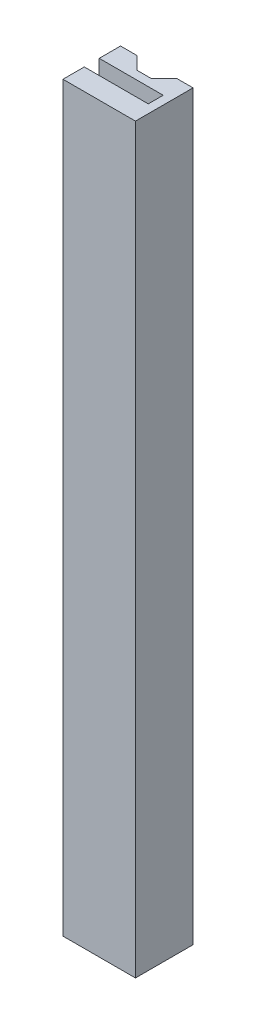
ISO-10303-21;
HEADER;
FILE_DESCRIPTION(('STEP AP214'),'2;1');
FILE_NAME('part.step','',(''),(''),'','','');
FILE_SCHEMA(('AUTOMOTIVE_DESIGN { 1 0 10303 214 1 1 1 1 }'));
ENDSEC;
DATA;
#1=APPLICATION_CONTEXT('core data for automotive mechanical design processes');
#2=APPLICATION_PROTOCOL_DEFINITION('international standard','automotive_design',2000,#1);
#3=PRODUCT_CONTEXT('',#1,'mechanical');
#4=PRODUCT('Part','Part','',(#3));
#5=PRODUCT_RELATED_PRODUCT_CATEGORY('part','',(#4));
#6=PRODUCT_DEFINITION_FORMATION('','',#4);
#7=PRODUCT_DEFINITION_CONTEXT('part definition',#1,'design');
#8=PRODUCT_DEFINITION('design','',#6,#7);
#9=PRODUCT_DEFINITION_SHAPE('','',#8);
#10=(LENGTH_UNIT() NAMED_UNIT(*) SI_UNIT(.MILLI.,.METRE.));
#11=(NAMED_UNIT(*) PLANE_ANGLE_UNIT() SI_UNIT($,.RADIAN.));
#12=(NAMED_UNIT(*) SI_UNIT($,.STERADIAN.) SOLID_ANGLE_UNIT());
#13=UNCERTAINTY_MEASURE_WITH_UNIT(LENGTH_MEASURE(1.E-05),#10,'distance_accuracy_value','');
#14=(GEOMETRIC_REPRESENTATION_CONTEXT(3) GLOBAL_UNCERTAINTY_ASSIGNED_CONTEXT((#13)) GLOBAL_UNIT_ASSIGNED_CONTEXT((#10,
#11,#12)) REPRESENTATION_CONTEXT('',''));
#15=CARTESIAN_POINT('',(0.,0.,0.));
#16=DIRECTION('',(0.,0.,1.));
#17=DIRECTION('',(1.,0.,0.));
#18=AXIS2_PLACEMENT_3D('',#15,#16,#17);
#19=CARTESIAN_POINT('',(-8.49813275223096,174.,-8.49999999999999));
#20=DIRECTION('',(1.,0.,0.));
#21=DIRECTION('',(0.,0.,-1.));
#22=AXIS2_PLACEMENT_3D('',#19,#20,#21);
#23=PLANE('',#22);
#24=DIRECTION('',(0.,0.,1.));
#25=VECTOR('',#24,1.);
#26=CARTESIAN_POINT('',(-8.49813275223096,0.,-8.49999999999999));
#27=LINE('',#26,#25);
#28=CARTESIAN_POINT('',(-8.49813275223096,0.,-13.5));
#29=VERTEX_POINT('',#28);
#30=CARTESIAN_POINT('',(-8.49813275223096,0.,-8.49999999999999));
#31=VERTEX_POINT('',#30);
#32=EDGE_CURVE('E154',#29,#31,#27,.T.);
#33=ORIENTED_EDGE('',*,*,#32,.T.);
#34=DIRECTION('',(0.,-1.,0.));
#35=VECTOR('',#34,1.);
#36=CARTESIAN_POINT('',(-8.49813275223096,174.,-8.49999999999999));
#37=LINE('',#36,#35);
#38=CARTESIAN_POINT('',(-8.49813275223096,174.,-8.49999999999999));
#39=VERTEX_POINT('',#38);
#40=EDGE_CURVE('E11',#39,#31,#37,.T.);
#41=ORIENTED_EDGE('',*,*,#40,.F.);
#42=DIRECTION('',(0.,0.,1.));
#43=VECTOR('',#42,1.);
#44=CARTESIAN_POINT('',(-8.49813275223096,174.,-8.49999999999999));
#45=LINE('',#44,#43);
#46=CARTESIAN_POINT('',(-8.49813275223096,174.,-13.5));
#47=VERTEX_POINT('',#46);
#48=EDGE_CURVE('E176',#47,#39,#45,.T.);
#49=ORIENTED_EDGE('',*,*,#48,.F.);
#50=DIRECTION('',(0.,-1.,0.));
#51=VECTOR('',#50,1.);
#52=CARTESIAN_POINT('',(-8.49813275223096,174.,-13.5));
#53=LINE('',#52,#51);
#54=EDGE_CURVE('E150',#47,#29,#53,.T.);
#55=ORIENTED_EDGE('',*,*,#54,.T.);
#56=EDGE_LOOP('',(#33,#41,#49,#55));
#57=FACE_BOUND('',#56,.T.);
#58=ADVANCED_FACE('F34',(#57),#23,.F.);
#59=CARTESIAN_POINT('',(6.50186724776904,174.,-8.5));
#60=DIRECTION('',(0.,0.,-1.));
#61=DIRECTION('',(-1.,0.,0.));
#62=AXIS2_PLACEMENT_3D('',#59,#60,#61);
#63=PLANE('',#62);
#64=DIRECTION('',(1.,0.,0.));
#65=VECTOR('',#64,1.);
#66=CARTESIAN_POINT('',(6.50186724776904,0.,-8.5));
#67=LINE('',#66,#65);
#68=CARTESIAN_POINT('',(6.50186724776904,0.,-8.5));
#69=VERTEX_POINT('',#68);
#70=EDGE_CURVE('E157',#31,#69,#67,.T.);
#71=ORIENTED_EDGE('',*,*,#70,.T.);
#72=DIRECTION('',(0.,-1.,0.));
#73=VECTOR('',#72,1.);
#74=CARTESIAN_POINT('',(6.50186724776904,174.,-8.5));
#75=LINE('',#74,#73);
#76=CARTESIAN_POINT('',(6.50186724776904,174.,-8.5));
#77=VERTEX_POINT('',#76);
#78=EDGE_CURVE('E42',#77,#69,#75,.T.);
#79=ORIENTED_EDGE('',*,*,#78,.F.);
#80=DIRECTION('',(1.,0.,0.));
#81=VECTOR('',#80,1.);
#82=CARTESIAN_POINT('',(6.50186724776904,174.,-8.5));
#83=LINE('',#82,#81);
#84=EDGE_CURVE('E105',#39,#77,#83,.T.);
#85=ORIENTED_EDGE('',*,*,#84,.F.);
#86=ORIENTED_EDGE('',*,*,#40,.T.);
#87=EDGE_LOOP('',(#71,#79,#85,#86));
#88=FACE_BOUND('',#87,.T.);
#89=ADVANCED_FACE('F254',(#88),#63,.F.);
#90=CARTESIAN_POINT('',(6.50186724776904,174.,-5.));
#91=DIRECTION('',(1.,0.,0.));
#92=DIRECTION('',(0.,0.,-1.));
#93=AXIS2_PLACEMENT_3D('',#90,#91,#92);
#94=PLANE('',#93);
#95=DIRECTION('',(0.,0.,1.));
#96=VECTOR('',#95,1.);
#97=CARTESIAN_POINT('',(6.50186724776904,0.,-5.));
#98=LINE('',#97,#96);
#99=CARTESIAN_POINT('',(6.50186724776904,0.,-5.));
#100=VERTEX_POINT('',#99);
#101=EDGE_CURVE('E159',#69,#100,#98,.T.);
#102=ORIENTED_EDGE('',*,*,#101,.T.);
#103=DIRECTION('',(0.,-1.,0.));
#104=VECTOR('',#103,1.);
#105=CARTESIAN_POINT('',(6.50186724776904,174.,-5.));
#106=LINE('',#105,#104);
#107=CARTESIAN_POINT('',(6.50186724776904,174.,-5.));
#108=VERTEX_POINT('',#107);
#109=EDGE_CURVE('E195',#108,#100,#106,.T.);
#110=ORIENTED_EDGE('',*,*,#109,.F.);
#111=DIRECTION('',(0.,0.,1.));
#112=VECTOR('',#111,1.);
#113=CARTESIAN_POINT('',(6.50186724776904,174.,-5.));
#114=LINE('',#113,#112);
#115=EDGE_CURVE('E203',#77,#108,#114,.T.);
#116=ORIENTED_EDGE('',*,*,#115,.F.);
#117=ORIENTED_EDGE('',*,*,#78,.T.);
#118=EDGE_LOOP('',(#102,#110,#116,#117));
#119=FACE_BOUND('',#118,.T.);
#120=ADVANCED_FACE('F201',(#119),#94,.F.);
#121=CARTESIAN_POINT('',(-8.49813275223096,174.,-5.));
#122=DIRECTION('',(0.,0.,1.));
#123=DIRECTION('',(1.,0.,0.));
#124=AXIS2_PLACEMENT_3D('',#121,#122,#123);
#125=PLANE('',#124);
#126=DIRECTION('',(-1.,0.,0.));
#127=VECTOR('',#126,1.);
#128=CARTESIAN_POINT('',(-8.49813275223096,0.,-5.));
#129=LINE('',#128,#127);
#130=CARTESIAN_POINT('',(-8.49813275223096,0.,-5.));
#131=VERTEX_POINT('',#130);
#132=EDGE_CURVE('E161',#100,#131,#129,.T.);
#133=ORIENTED_EDGE('',*,*,#132,.T.);
#134=DIRECTION('',(0.,-1.,0.));
#135=VECTOR('',#134,1.);
#136=CARTESIAN_POINT('',(-8.49813275223096,174.,-5.));
#137=LINE('',#136,#135);
#138=CARTESIAN_POINT('',(-8.49813275223096,174.,-5.));
#139=VERTEX_POINT('',#138);
#140=EDGE_CURVE('E192',#139,#131,#137,.T.);
#141=ORIENTED_EDGE('',*,*,#140,.F.);
#142=DIRECTION('',(-1.,0.,0.));
#143=VECTOR('',#142,1.);
#144=CARTESIAN_POINT('',(-8.49813275223096,174.,-5.));
#145=LINE('',#144,#143);
#146=EDGE_CURVE('E221',#108,#139,#145,.T.);
#147=ORIENTED_EDGE('',*,*,#146,.F.);
#148=ORIENTED_EDGE('',*,*,#109,.T.);
#149=EDGE_LOOP('',(#133,#141,#147,#148));
#150=FACE_BOUND('',#149,.T.);
#151=ADVANCED_FACE('F212',(#150),#125,.F.);
#152=CARTESIAN_POINT('',(-8.49813275223096,174.,0.));
#153=DIRECTION('',(1.,0.,0.));
#154=DIRECTION('',(0.,0.,-1.));
#155=AXIS2_PLACEMENT_3D('',#152,#153,#154);
#156=PLANE('',#155);
#157=DIRECTION('',(0.,0.,1.));
#158=VECTOR('',#157,1.);
#159=CARTESIAN_POINT('',(-8.49813275223096,0.,0.));
#160=LINE('',#159,#158);
#161=CARTESIAN_POINT('',(-8.49813275223096,0.,0.));
#162=VERTEX_POINT('',#161);
#163=EDGE_CURVE('E163',#131,#162,#160,.T.);
#164=ORIENTED_EDGE('',*,*,#163,.T.);
#165=DIRECTION('',(0.,-1.,0.));
#166=VECTOR('',#165,1.);
#167=CARTESIAN_POINT('',(-8.49813275223096,174.,0.));
#168=LINE('',#167,#166);
#169=CARTESIAN_POINT('',(-8.49813275223096,174.,0.));
#170=VERTEX_POINT('',#169);
#171=EDGE_CURVE('E189',#170,#162,#168,.T.);
#172=ORIENTED_EDGE('',*,*,#171,.F.);
#173=DIRECTION('',(0.,0.,1.));
#174=VECTOR('',#173,1.);
#175=CARTESIAN_POINT('',(-8.49813275223096,174.,0.));
#176=LINE('',#175,#174);
#177=EDGE_CURVE('E218',#139,#170,#176,.T.);
#178=ORIENTED_EDGE('',*,*,#177,.F.);
#179=ORIENTED_EDGE('',*,*,#140,.T.);
#180=EDGE_LOOP('',(#164,#172,#178,#179));
#181=FACE_BOUND('',#180,.T.);
#182=ADVANCED_FACE('F216',(#181),#156,.F.);
#183=CARTESIAN_POINT('',(8.49813275223096,174.,0.));
#184=DIRECTION('',(0.,0.,-1.));
#185=DIRECTION('',(-1.,0.,0.));
#186=AXIS2_PLACEMENT_3D('',#183,#184,#185);
#187=PLANE('',#186);
#188=DIRECTION('',(1.,0.,0.));
#189=VECTOR('',#188,1.);
#190=CARTESIAN_POINT('',(8.49813275223096,0.,0.));
#191=LINE('',#190,#189);
#192=CARTESIAN_POINT('',(8.49813275223096,0.,0.));
#193=VERTEX_POINT('',#192);
#194=EDGE_CURVE('E165',#162,#193,#191,.T.);
#195=ORIENTED_EDGE('',*,*,#194,.T.);
#196=DIRECTION('',(0.,-1.,0.));
#197=VECTOR('',#196,1.);
#198=CARTESIAN_POINT('',(8.49813275223096,174.,0.));
#199=LINE('',#198,#197);
#200=CARTESIAN_POINT('',(8.49813275223096,174.,0.));
#201=VERTEX_POINT('',#200);
#202=EDGE_CURVE('E186',#201,#193,#199,.T.);
#203=ORIENTED_EDGE('',*,*,#202,.F.);
#204=DIRECTION('',(1.,0.,0.));
#205=VECTOR('',#204,1.);
#206=CARTESIAN_POINT('',(8.49813275223096,174.,0.));
#207=LINE('',#206,#205);
#208=EDGE_CURVE('E220',#170,#201,#207,.T.);
#209=ORIENTED_EDGE('',*,*,#208,.F.);
#210=ORIENTED_EDGE('',*,*,#171,.T.);
#211=EDGE_LOOP('',(#195,#203,#209,#210));
#212=FACE_BOUND('',#211,.T.);
#213=ADVANCED_FACE('F267',(#212),#187,.F.);
#214=CARTESIAN_POINT('',(8.49813275223096,174.,-13.5));
#215=DIRECTION('',(-1.,0.,0.));
#216=DIRECTION('',(0.,0.,1.));
#217=AXIS2_PLACEMENT_3D('',#214,#215,#216);
#218=PLANE('',#217);
#219=DIRECTION('',(0.,0.,-1.));
#220=VECTOR('',#219,1.);
#221=CARTESIAN_POINT('',(8.49813275223096,0.,-13.5));
#222=LINE('',#221,#220);
#223=CARTESIAN_POINT('',(8.49813275223096,0.,-13.5));
#224=VERTEX_POINT('',#223);
#225=EDGE_CURVE('E167',#193,#224,#222,.T.);
#226=ORIENTED_EDGE('',*,*,#225,.T.);
#227=DIRECTION('',(0.,-1.,0.));
#228=VECTOR('',#227,1.);
#229=CARTESIAN_POINT('',(8.49813275223096,174.,-13.5));
#230=LINE('',#229,#228);
#231=CARTESIAN_POINT('',(8.49813275223096,174.,-13.5));
#232=VERTEX_POINT('',#231);
#233=EDGE_CURVE('E183',#232,#224,#230,.T.);
#234=ORIENTED_EDGE('',*,*,#233,.F.);
#235=DIRECTION('',(0.,0.,-1.));
#236=VECTOR('',#235,1.);
#237=CARTESIAN_POINT('',(8.49813275223096,174.,-13.5));
#238=LINE('',#237,#236);
#239=EDGE_CURVE('E223',#201,#232,#238,.T.);
#240=ORIENTED_EDGE('',*,*,#239,.F.);
#241=ORIENTED_EDGE('',*,*,#202,.T.);
#242=EDGE_LOOP('',(#226,#234,#240,#241));
#243=FACE_BOUND('',#242,.T.);
#244=ADVANCED_FACE('F270',(#243),#218,.F.);
#245=CARTESIAN_POINT('',(4.64813275223096,174.,-13.5));
#246=DIRECTION('',(0.,0.,1.));
#247=DIRECTION('',(1.,0.,0.));
#248=AXIS2_PLACEMENT_3D('',#245,#246,#247);
#249=PLANE('',#248);
#250=DIRECTION('',(-1.,0.,0.));
#251=VECTOR('',#250,1.);
#252=CARTESIAN_POINT('',(4.64813275223096,0.,-13.5));
#253=LINE('',#252,#251);
#254=CARTESIAN_POINT('',(4.64813275223096,0.,-13.5));
#255=VERTEX_POINT('',#254);
#256=EDGE_CURVE('E169',#224,#255,#253,.T.);
#257=ORIENTED_EDGE('',*,*,#256,.T.);
#258=DIRECTION('',(0.,-1.,0.));
#259=VECTOR('',#258,1.);
#260=CARTESIAN_POINT('',(4.64813275223096,174.,-13.5));
#261=LINE('',#260,#259);
#262=CARTESIAN_POINT('',(4.64813275223096,174.,-13.5));
#263=VERTEX_POINT('',#262);
#264=EDGE_CURVE('E180',#263,#255,#261,.T.);
#265=ORIENTED_EDGE('',*,*,#264,.F.);
#266=DIRECTION('',(-1.,0.,0.));
#267=VECTOR('',#266,1.);
#268=CARTESIAN_POINT('',(4.64813275223096,174.,-13.5));
#269=LINE('',#268,#267);
#270=EDGE_CURVE('E229',#232,#263,#269,.T.);
#271=ORIENTED_EDGE('',*,*,#270,.F.);
#272=ORIENTED_EDGE('',*,*,#233,.T.);
#273=EDGE_LOOP('',(#257,#265,#271,#272));
#274=FACE_BOUND('',#273,.T.);
#275=ADVANCED_FACE('F235',(#274),#249,.F.);
#276=CARTESIAN_POINT('',(1.65,174.,-10.501867247769));
#277=DIRECTION('',(0.707106781186547,0.,0.707106781186548));
#278=DIRECTION('',(0.707106781186548,0.,-0.707106781186547));
#279=AXIS2_PLACEMENT_3D('',#276,#277,#278);
#280=PLANE('',#279);
#281=DIRECTION('',(-0.707106781186548,0.,0.707106781186547));
#282=VECTOR('',#281,1.);
#283=CARTESIAN_POINT('',(1.65,0.,-10.501867247769));
#284=LINE('',#283,#282);
#285=CARTESIAN_POINT('',(1.65,0.,-10.501867247769));
#286=VERTEX_POINT('',#285);
#287=EDGE_CURVE('E171',#255,#286,#284,.T.);
#288=ORIENTED_EDGE('',*,*,#287,.T.);
#289=DIRECTION('',(0.,-1.,0.));
#290=VECTOR('',#289,1.);
#291=CARTESIAN_POINT('',(1.65,174.,-10.501867247769));
#292=LINE('',#291,#290);
#293=CARTESIAN_POINT('',(1.65,174.,-10.501867247769));
#294=VERTEX_POINT('',#293);
#295=EDGE_CURVE('E145',#294,#286,#292,.T.);
#296=ORIENTED_EDGE('',*,*,#295,.F.);
#297=DIRECTION('',(-0.707106781186548,0.,0.707106781186547));
#298=VECTOR('',#297,1.);
#299=CARTESIAN_POINT('',(1.65,174.,-10.501867247769));
#300=LINE('',#299,#298);
#301=EDGE_CURVE('E136',#263,#294,#300,.T.);
#302=ORIENTED_EDGE('',*,*,#301,.F.);
#303=ORIENTED_EDGE('',*,*,#264,.T.);
#304=EDGE_LOOP('',(#288,#296,#302,#303));
#305=FACE_BOUND('',#304,.T.);
#306=ADVANCED_FACE('F239',(#305),#280,.F.);
#307=CARTESIAN_POINT('',(-1.65,174.,-10.501867247769));
#308=DIRECTION('',(0.,0.,1.));
#309=DIRECTION('',(1.,0.,0.));
#310=AXIS2_PLACEMENT_3D('',#307,#308,#309);
#311=PLANE('',#310);
#312=DIRECTION('',(-1.,0.,0.));
#313=VECTOR('',#312,1.);
#314=CARTESIAN_POINT('',(-1.65,0.,-10.501867247769));
#315=LINE('',#314,#313);
#316=CARTESIAN_POINT('',(-1.65,0.,-10.501867247769));
#317=VERTEX_POINT('',#316);
#318=EDGE_CURVE('E144',#286,#317,#315,.T.);
#319=ORIENTED_EDGE('',*,*,#318,.T.);
#320=DIRECTION('',(0.,-1.,0.));
#321=VECTOR('',#320,1.);
#322=CARTESIAN_POINT('',(-1.65,174.,-10.501867247769));
#323=LINE('',#322,#321);
#324=CARTESIAN_POINT('',(-1.65,174.,-10.501867247769));
#325=VERTEX_POINT('',#324);
#326=EDGE_CURVE('E141',#325,#317,#323,.T.);
#327=ORIENTED_EDGE('',*,*,#326,.F.);
#328=DIRECTION('',(-1.,0.,0.));
#329=VECTOR('',#328,1.);
#330=CARTESIAN_POINT('',(-1.65,174.,-10.501867247769));
#331=LINE('',#330,#329);
#332=EDGE_CURVE('E130',#294,#325,#331,.T.);
#333=ORIENTED_EDGE('',*,*,#332,.F.);
#334=ORIENTED_EDGE('',*,*,#295,.T.);
#335=EDGE_LOOP('',(#319,#327,#333,#334));
#336=FACE_BOUND('',#335,.T.);
#337=ADVANCED_FACE('F142',(#336),#311,.F.);
#338=CARTESIAN_POINT('',(-4.64813275223096,174.,-13.5));
#339=DIRECTION('',(-0.707106781186547,0.,0.707106781186548));
#340=DIRECTION('',(0.707106781186548,0.,0.707106781186547));
#341=AXIS2_PLACEMENT_3D('',#338,#339,#340);
#342=PLANE('',#341);
#343=DIRECTION('',(-0.707106781186548,0.,-0.707106781186547));
#344=VECTOR('',#343,1.);
#345=CARTESIAN_POINT('',(-4.64813275223096,0.,-13.5));
#346=LINE('',#345,#344);
#347=CARTESIAN_POINT('',(-4.64813275223096,0.,-13.5));
#348=VERTEX_POINT('',#347);
#349=EDGE_CURVE('E91',#317,#348,#346,.T.);
#350=ORIENTED_EDGE('',*,*,#349,.T.);
#351=DIRECTION('',(0.,-1.,0.));
#352=VECTOR('',#351,1.);
#353=CARTESIAN_POINT('',(-4.64813275223096,174.,-13.5));
#354=LINE('',#353,#352);
#355=CARTESIAN_POINT('',(-4.64813275223096,174.,-13.5));
#356=VERTEX_POINT('',#355);
#357=EDGE_CURVE('E146',#356,#348,#354,.T.);
#358=ORIENTED_EDGE('',*,*,#357,.F.);
#359=DIRECTION('',(-0.707106781186548,0.,-0.707106781186547));
#360=VECTOR('',#359,1.);
#361=CARTESIAN_POINT('',(-4.64813275223096,174.,-13.5));
#362=LINE('',#361,#360);
#363=EDGE_CURVE('E134',#325,#356,#362,.T.);
#364=ORIENTED_EDGE('',*,*,#363,.F.);
#365=ORIENTED_EDGE('',*,*,#326,.T.);
#366=EDGE_LOOP('',(#350,#358,#364,#365));
#367=FACE_BOUND('',#366,.T.);
#368=ADVANCED_FACE('F148',(#367),#342,.F.);
#369=CARTESIAN_POINT('',(-8.49813275223096,174.,-13.5));
#370=DIRECTION('',(0.,0.,1.));
#371=DIRECTION('',(1.,0.,0.));
#372=AXIS2_PLACEMENT_3D('',#369,#370,#371);
#373=PLANE('',#372);
#374=DIRECTION('',(-1.,0.,0.));
#375=VECTOR('',#374,1.);
#376=CARTESIAN_POINT('',(-8.49813275223096,0.,-13.5));
#377=LINE('',#376,#375);
#378=EDGE_CURVE('E97',#348,#29,#377,.T.);
#379=ORIENTED_EDGE('',*,*,#378,.T.);
#380=ORIENTED_EDGE('',*,*,#54,.F.);
#381=DIRECTION('',(-1.,0.,0.));
#382=VECTOR('',#381,1.);
#383=CARTESIAN_POINT('',(-8.49813275223096,174.,-13.5));
#384=LINE('',#383,#382);
#385=EDGE_CURVE('E50',#356,#47,#384,.T.);
#386=ORIENTED_EDGE('',*,*,#385,.F.);
#387=ORIENTED_EDGE('',*,*,#357,.T.);
#388=EDGE_LOOP('',(#379,#380,#386,#387));
#389=FACE_BOUND('',#388,.T.);
#390=ADVANCED_FACE('F243',(#389),#373,.F.);
#391=CARTESIAN_POINT('',(0.,174.,0.));
#392=DIRECTION('',(0.,-1.,0.));
#393=DIRECTION('',(0.,0.,-1.));
#394=AXIS2_PLACEMENT_3D('',#391,#392,#393);
#395=PLANE('',#394);
#396=ORIENTED_EDGE('',*,*,#48,.T.);
#397=ORIENTED_EDGE('',*,*,#84,.T.);
#398=ORIENTED_EDGE('',*,*,#115,.T.);
#399=ORIENTED_EDGE('',*,*,#146,.T.);
#400=ORIENTED_EDGE('',*,*,#177,.T.);
#401=ORIENTED_EDGE('',*,*,#208,.T.);
#402=ORIENTED_EDGE('',*,*,#239,.T.);
#403=ORIENTED_EDGE('',*,*,#270,.T.);
#404=ORIENTED_EDGE('',*,*,#301,.T.);
#405=ORIENTED_EDGE('',*,*,#332,.T.);
#406=ORIENTED_EDGE('',*,*,#363,.T.);
#407=ORIENTED_EDGE('',*,*,#385,.T.);
#408=EDGE_LOOP('',(#396,#397,#398,#399,#400,#401,#402,#403,#404,#405,#406,#407));
#409=FACE_BOUND('',#408,.T.);
#410=ADVANCED_FACE('F132',(#409),#395,.F.);
#411=CARTESIAN_POINT('',(0.,0.,0.));
#412=DIRECTION('',(0.,-1.,0.));
#413=DIRECTION('',(0.,0.,-1.));
#414=AXIS2_PLACEMENT_3D('',#411,#412,#413);
#415=PLANE('',#414);
#416=ORIENTED_EDGE('',*,*,#32,.F.);
#417=ORIENTED_EDGE('',*,*,#378,.F.);
#418=ORIENTED_EDGE('',*,*,#349,.F.);
#419=ORIENTED_EDGE('',*,*,#318,.F.);
#420=ORIENTED_EDGE('',*,*,#287,.F.);
#421=ORIENTED_EDGE('',*,*,#256,.F.);
#422=ORIENTED_EDGE('',*,*,#225,.F.);
#423=ORIENTED_EDGE('',*,*,#194,.F.);
#424=ORIENTED_EDGE('',*,*,#163,.F.);
#425=ORIENTED_EDGE('',*,*,#132,.F.);
#426=ORIENTED_EDGE('',*,*,#101,.F.);
#427=ORIENTED_EDGE('',*,*,#70,.F.);
#428=EDGE_LOOP('',(#416,#417,#418,#419,#420,#421,#422,#423,#424,#425,#426,#427));
#429=FACE_BOUND('',#428,.T.);
#430=ADVANCED_FACE('F207',(#429),#415,.T.);
#431=CLOSED_SHELL('',(#58,#89,#120,#151,#182,#213,#244,#275,#306,#337,#368,#390,#410,#430));
#432=MANIFOLD_SOLID_BREP('B2',#431);
#433=ADVANCED_BREP_SHAPE_REPRESENTATION('',(#18,#432),#14);
#434=SHAPE_DEFINITION_REPRESENTATION(#9,#433);
ENDSEC;
END-ISO-10303-21;
